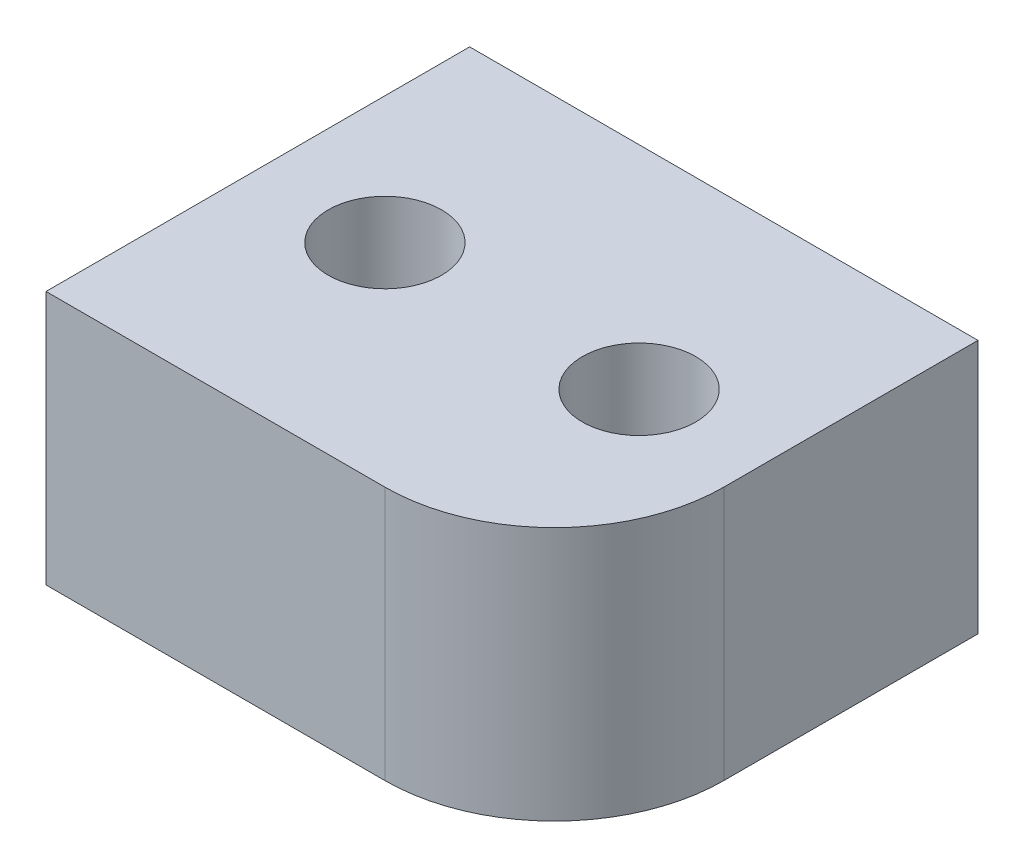
ISO-10303-21;
HEADER;
FILE_DESCRIPTION(('STEP AP214'),'2;1');
FILE_NAME('part.step','',(''),(''),'','','');
FILE_SCHEMA(('AUTOMOTIVE_DESIGN { 1 0 10303 214 1 1 1 1 }'));
ENDSEC;
DATA;
#1=APPLICATION_CONTEXT('core data for automotive mechanical design processes');
#2=APPLICATION_PROTOCOL_DEFINITION('international standard','automotive_design',2000,#1);
#3=PRODUCT_CONTEXT('',#1,'mechanical');
#4=PRODUCT('Part','Part','',(#3));
#5=PRODUCT_RELATED_PRODUCT_CATEGORY('part','',(#4));
#6=PRODUCT_DEFINITION_FORMATION('','',#4);
#7=PRODUCT_DEFINITION_CONTEXT('part definition',#1,'design');
#8=PRODUCT_DEFINITION('design','',#6,#7);
#9=PRODUCT_DEFINITION_SHAPE('','',#8);
#10=(LENGTH_UNIT() NAMED_UNIT(*) SI_UNIT(.MILLI.,.METRE.));
#11=(NAMED_UNIT(*) PLANE_ANGLE_UNIT() SI_UNIT($,.RADIAN.));
#12=(NAMED_UNIT(*) SI_UNIT($,.STERADIAN.) SOLID_ANGLE_UNIT());
#13=UNCERTAINTY_MEASURE_WITH_UNIT(LENGTH_MEASURE(1.E-05),#10,'distance_accuracy_value','');
#14=(GEOMETRIC_REPRESENTATION_CONTEXT(3) GLOBAL_UNCERTAINTY_ASSIGNED_CONTEXT((#13)) GLOBAL_UNIT_ASSIGNED_CONTEXT((#10,
#11,#12)) REPRESENTATION_CONTEXT('',''));
#15=CARTESIAN_POINT('',(0.,0.,0.));
#16=DIRECTION('',(0.,0.,1.));
#17=DIRECTION('',(1.,0.,0.));
#18=AXIS2_PLACEMENT_3D('',#15,#16,#17);
#19=CARTESIAN_POINT('',(0.,7.62,0.));
#20=DIRECTION('',(0.,-1.,0.));
#21=DIRECTION('',(0.,0.,-1.));
#22=AXIS2_PLACEMENT_3D('',#19,#20,#21);
#23=PLANE('',#22);
#24=DIRECTION('',(1.,0.,0.));
#25=VECTOR('',#24,1.);
#26=CARTESIAN_POINT('',(0.,7.62,0.));
#27=LINE('',#26,#25);
#28=CARTESIAN_POINT('',(0.,7.62,0.));
#29=VERTEX_POINT('',#28);
#30=CARTESIAN_POINT('',(10.16,7.62,0.));
#31=VERTEX_POINT('',#30);
#32=EDGE_CURVE('E88',#29,#31,#27,.T.);
#33=ORIENTED_EDGE('',*,*,#32,.T.);
#34=CARTESIAN_POINT('',(10.16,7.62,-5.08));
#35=DIRECTION('',(0.,-1.,0.));
#36=DIRECTION('',(0.,0.,-1.));
#37=AXIS2_PLACEMENT_3D('',#34,#35,#36);
#38=CIRCLE('',#37,5.08);
#39=CARTESIAN_POINT('',(15.24,7.62,-5.08));
#40=VERTEX_POINT('',#39);
#41=EDGE_CURVE('E11',#31,#40,#38,.F.);
#42=ORIENTED_EDGE('',*,*,#41,.T.);
#43=DIRECTION('',(0.,0.,-1.));
#44=VECTOR('',#43,1.);
#45=CARTESIAN_POINT('',(15.24,7.62,0.));
#46=LINE('',#45,#44);
#47=CARTESIAN_POINT('',(15.24,7.62,-12.7));
#48=VERTEX_POINT('',#47);
#49=EDGE_CURVE('E97',#40,#48,#46,.T.);
#50=ORIENTED_EDGE('',*,*,#49,.T.);
#51=DIRECTION('',(-1.,0.,0.));
#52=VECTOR('',#51,1.);
#53=CARTESIAN_POINT('',(0.,7.62,-12.7));
#54=LINE('',#53,#52);
#55=CARTESIAN_POINT('',(0.,7.62,-12.7));
#56=VERTEX_POINT('',#55);
#57=EDGE_CURVE('E103',#48,#56,#54,.T.);
#58=ORIENTED_EDGE('',*,*,#57,.T.);
#59=DIRECTION('',(0.,0.,1.));
#60=VECTOR('',#59,1.);
#61=CARTESIAN_POINT('',(0.,7.62,0.));
#62=LINE('',#61,#60);
#63=EDGE_CURVE('E98',#56,#29,#62,.T.);
#64=ORIENTED_EDGE('',*,*,#63,.T.);
#65=EDGE_LOOP('',(#33,#42,#50,#58,#64));
#66=FACE_BOUND('',#65,.T.);
#67=CARTESIAN_POINT('',(11.43,7.62,-6.35));
#68=DIRECTION('',(0.,1.,0.));
#69=DIRECTION('',(0.,0.,1.));
#70=AXIS2_PLACEMENT_3D('',#67,#68,#69);
#71=CIRCLE('',#70,1.7);
#72=CARTESIAN_POINT('',(11.43,7.62,-8.05));
#73=VERTEX_POINT('',#72);
#74=EDGE_CURVE('E140',#73,#73,#71,.T.);
#75=ORIENTED_EDGE('',*,*,#74,.F.);
#76=EDGE_LOOP('',(#75));
#77=FACE_BOUND('',#76,.T.);
#78=CARTESIAN_POINT('',(3.81,7.62,-6.35));
#79=DIRECTION('',(0.,1.,0.));
#80=DIRECTION('',(0.,0.,1.));
#81=AXIS2_PLACEMENT_3D('',#78,#79,#80);
#82=CIRCLE('',#81,1.7);
#83=CARTESIAN_POINT('',(3.81,7.62,-8.05));
#84=VERTEX_POINT('',#83);
#85=EDGE_CURVE('E149',#84,#84,#82,.T.);
#86=ORIENTED_EDGE('',*,*,#85,.F.);
#87=EDGE_LOOP('',(#86));
#88=FACE_BOUND('',#87,.T.);
#89=ADVANCED_FACE('F44',(#66,#77,#88),#23,.F.);
#90=CARTESIAN_POINT('',(0.,0.,0.));
#91=DIRECTION('',(0.,-1.,0.));
#92=DIRECTION('',(0.,0.,-1.));
#93=AXIS2_PLACEMENT_3D('',#90,#91,#92);
#94=PLANE('',#93);
#95=CARTESIAN_POINT('',(11.43,0.,-6.35));
#96=DIRECTION('',(0.,1.,0.));
#97=DIRECTION('',(0.,0.,1.));
#98=AXIS2_PLACEMENT_3D('',#95,#96,#97);
#99=CIRCLE('',#98,1.7);
#100=CARTESIAN_POINT('',(11.43,0.,-8.05));
#101=VERTEX_POINT('',#100);
#102=EDGE_CURVE('E145',#101,#101,#99,.T.);
#103=ORIENTED_EDGE('',*,*,#102,.T.);
#104=EDGE_LOOP('',(#103));
#105=FACE_BOUND('',#104,.T.);
#106=DIRECTION('',(0.,0.,-1.));
#107=VECTOR('',#106,1.);
#108=CARTESIAN_POINT('',(15.24,0.,0.));
#109=LINE('',#108,#107);
#110=CARTESIAN_POINT('',(15.24,0.,-5.08));
#111=VERTEX_POINT('',#110);
#112=CARTESIAN_POINT('',(15.24,0.,-12.7));
#113=VERTEX_POINT('',#112);
#114=EDGE_CURVE('E132',#111,#113,#109,.T.);
#115=ORIENTED_EDGE('',*,*,#114,.F.);
#116=CARTESIAN_POINT('',(10.16,0.,-5.08));
#117=DIRECTION('',(0.,-1.,0.));
#118=DIRECTION('',(0.,0.,-1.));
#119=AXIS2_PLACEMENT_3D('',#116,#117,#118);
#120=CIRCLE('',#119,5.08);
#121=CARTESIAN_POINT('',(10.16,0.,0.));
#122=VERTEX_POINT('',#121);
#123=EDGE_CURVE('E67',#111,#122,#120,.T.);
#124=ORIENTED_EDGE('',*,*,#123,.T.);
#125=DIRECTION('',(1.,0.,0.));
#126=VECTOR('',#125,1.);
#127=CARTESIAN_POINT('',(0.,0.,0.));
#128=LINE('',#127,#126);
#129=CARTESIAN_POINT('',(0.,0.,0.));
#130=VERTEX_POINT('',#129);
#131=EDGE_CURVE('E135',#130,#122,#128,.T.);
#132=ORIENTED_EDGE('',*,*,#131,.F.);
#133=DIRECTION('',(0.,0.,1.));
#134=VECTOR('',#133,1.);
#135=CARTESIAN_POINT('',(0.,0.,0.));
#136=LINE('',#135,#134);
#137=CARTESIAN_POINT('',(0.,0.,-12.7));
#138=VERTEX_POINT('',#137);
#139=EDGE_CURVE('E112',#138,#130,#136,.T.);
#140=ORIENTED_EDGE('',*,*,#139,.F.);
#141=DIRECTION('',(-1.,0.,0.));
#142=VECTOR('',#141,1.);
#143=CARTESIAN_POINT('',(0.,0.,-12.7));
#144=LINE('',#143,#142);
#145=EDGE_CURVE('E108',#113,#138,#144,.T.);
#146=ORIENTED_EDGE('',*,*,#145,.F.);
#147=EDGE_LOOP('',(#115,#124,#132,#140,#146));
#148=FACE_BOUND('',#147,.T.);
#149=CARTESIAN_POINT('',(3.81,0.,-6.35));
#150=DIRECTION('',(0.,1.,0.));
#151=DIRECTION('',(0.,0.,1.));
#152=AXIS2_PLACEMENT_3D('',#149,#150,#151);
#153=CIRCLE('',#152,1.7);
#154=CARTESIAN_POINT('',(3.81,0.,-8.05));
#155=VERTEX_POINT('',#154);
#156=EDGE_CURVE('E153',#155,#155,#153,.T.);
#157=ORIENTED_EDGE('',*,*,#156,.T.);
#158=EDGE_LOOP('',(#157));
#159=FACE_BOUND('',#158,.T.);
#160=ADVANCED_FACE('F165',(#105,#148,#159),#94,.T.);
#161=CARTESIAN_POINT('',(0.,7.62,0.));
#162=DIRECTION('',(1.,0.,0.));
#163=DIRECTION('',(0.,0.,-1.));
#164=AXIS2_PLACEMENT_3D('',#161,#162,#163);
#165=PLANE('',#164);
#166=ORIENTED_EDGE('',*,*,#139,.T.);
#167=DIRECTION('',(0.,-1.,0.));
#168=VECTOR('',#167,1.);
#169=CARTESIAN_POINT('',(0.,7.62,0.));
#170=LINE('',#169,#168);
#171=EDGE_CURVE('E92',#29,#130,#170,.T.);
#172=ORIENTED_EDGE('',*,*,#171,.F.);
#173=ORIENTED_EDGE('',*,*,#63,.F.);
#174=DIRECTION('',(0.,-1.,0.));
#175=VECTOR('',#174,1.);
#176=CARTESIAN_POINT('',(0.,7.62,-12.7));
#177=LINE('',#176,#175);
#178=EDGE_CURVE('E122',#56,#138,#177,.T.);
#179=ORIENTED_EDGE('',*,*,#178,.T.);
#180=EDGE_LOOP('',(#166,#172,#173,#179));
#181=FACE_BOUND('',#180,.T.);
#182=ADVANCED_FACE('F110',(#181),#165,.F.);
#183=CARTESIAN_POINT('',(0.,7.62,0.));
#184=DIRECTION('',(0.,0.,-1.));
#185=DIRECTION('',(-1.,0.,0.));
#186=AXIS2_PLACEMENT_3D('',#183,#184,#185);
#187=PLANE('',#186);
#188=ORIENTED_EDGE('',*,*,#131,.T.);
#189=DIRECTION('',(0.,-1.,0.));
#190=VECTOR('',#189,1.);
#191=CARTESIAN_POINT('',(10.16,7.62,0.));
#192=LINE('',#191,#190);
#193=EDGE_CURVE('E53',#122,#31,#192,.F.);
#194=ORIENTED_EDGE('',*,*,#193,.T.);
#195=ORIENTED_EDGE('',*,*,#32,.F.);
#196=ORIENTED_EDGE('',*,*,#171,.T.);
#197=EDGE_LOOP('',(#188,#194,#195,#196));
#198=FACE_BOUND('',#197,.T.);
#199=ADVANCED_FACE('F90',(#198),#187,.F.);
#200=CARTESIAN_POINT('',(15.24,7.62,0.));
#201=DIRECTION('',(-1.,0.,0.));
#202=DIRECTION('',(0.,0.,1.));
#203=AXIS2_PLACEMENT_3D('',#200,#201,#202);
#204=PLANE('',#203);
#205=ORIENTED_EDGE('',*,*,#49,.F.);
#206=DIRECTION('',(0.,-1.,0.));
#207=VECTOR('',#206,1.);
#208=CARTESIAN_POINT('',(15.24,7.62,-5.08));
#209=LINE('',#208,#207);
#210=EDGE_CURVE('E114',#40,#111,#209,.T.);
#211=ORIENTED_EDGE('',*,*,#210,.T.);
#212=ORIENTED_EDGE('',*,*,#114,.T.);
#213=DIRECTION('',(0.,-1.,0.));
#214=VECTOR('',#213,1.);
#215=CARTESIAN_POINT('',(15.24,7.62,-12.7));
#216=LINE('',#215,#214);
#217=EDGE_CURVE('E115',#48,#113,#216,.T.);
#218=ORIENTED_EDGE('',*,*,#217,.F.);
#219=EDGE_LOOP('',(#205,#211,#212,#218));
#220=FACE_BOUND('',#219,.T.);
#221=ADVANCED_FACE('F180',(#220),#204,.F.);
#222=CARTESIAN_POINT('',(0.,7.62,-12.7));
#223=DIRECTION('',(0.,0.,1.));
#224=DIRECTION('',(1.,0.,0.));
#225=AXIS2_PLACEMENT_3D('',#222,#223,#224);
#226=PLANE('',#225);
#227=ORIENTED_EDGE('',*,*,#145,.T.);
#228=ORIENTED_EDGE('',*,*,#178,.F.);
#229=ORIENTED_EDGE('',*,*,#57,.F.);
#230=ORIENTED_EDGE('',*,*,#217,.T.);
#231=EDGE_LOOP('',(#227,#228,#229,#230));
#232=FACE_BOUND('',#231,.T.);
#233=ADVANCED_FACE('F177',(#232),#226,.F.);
#234=CARTESIAN_POINT('',(11.43,7.62,-6.35));
#235=DIRECTION('',(0.,-1.,0.));
#236=DIRECTION('',(0.,0.,-1.));
#237=AXIS2_PLACEMENT_3D('',#234,#235,#236);
#238=CYLINDRICAL_SURFACE('',#237,1.7);
#239=CARTESIAN_POINT('',(11.43,7.62,-8.05));
#240=CARTESIAN_POINT('',(11.43,7.540625,-8.05));
#241=CARTESIAN_POINT('',(11.43,7.46125,-8.05));
#242=CARTESIAN_POINT('',(11.43,7.3025,-8.05));
#243=CARTESIAN_POINT('',(11.43,7.223125,-8.05));
#244=CARTESIAN_POINT('',(11.43,7.064375,-8.05));
#245=CARTESIAN_POINT('',(11.43,6.985,-8.05));
#246=CARTESIAN_POINT('',(11.43,6.82625,-8.05));
#247=CARTESIAN_POINT('',(11.43,6.746875,-8.05));
#248=CARTESIAN_POINT('',(11.43,6.588125,-8.05));
#249=CARTESIAN_POINT('',(11.43,6.50875,-8.05));
#250=CARTESIAN_POINT('',(11.43,6.35,-8.05));
#251=CARTESIAN_POINT('',(11.43,6.270625,-8.05));
#252=CARTESIAN_POINT('',(11.43,6.111875,-8.05));
#253=CARTESIAN_POINT('',(11.43,6.0325,-8.05));
#254=CARTESIAN_POINT('',(11.43,5.87375,-8.05));
#255=CARTESIAN_POINT('',(11.43,5.794375,-8.05));
#256=CARTESIAN_POINT('',(11.43,5.635625,-8.05));
#257=CARTESIAN_POINT('',(11.43,5.55625,-8.05));
#258=CARTESIAN_POINT('',(11.43,5.3975,-8.05));
#259=CARTESIAN_POINT('',(11.43,5.318125,-8.05));
#260=CARTESIAN_POINT('',(11.43,5.159375,-8.05));
#261=CARTESIAN_POINT('',(11.43,5.08,-8.05));
#262=CARTESIAN_POINT('',(11.43,4.92125,-8.05));
#263=CARTESIAN_POINT('',(11.43,4.841875,-8.05));
#264=CARTESIAN_POINT('',(11.43,4.683125,-8.05));
#265=CARTESIAN_POINT('',(11.43,4.60375,-8.05));
#266=CARTESIAN_POINT('',(11.43,4.445,-8.05));
#267=CARTESIAN_POINT('',(11.43,4.365625,-8.05));
#268=CARTESIAN_POINT('',(11.43,4.206875,-8.05));
#269=CARTESIAN_POINT('',(11.43,4.1275,-8.05));
#270=CARTESIAN_POINT('',(11.43,3.96875,-8.05));
#271=CARTESIAN_POINT('',(11.43,3.889375,-8.05));
#272=CARTESIAN_POINT('',(11.43,3.730625,-8.05));
#273=CARTESIAN_POINT('',(11.43,3.65125,-8.05));
#274=CARTESIAN_POINT('',(11.43,3.4925,-8.05));
#275=CARTESIAN_POINT('',(11.43,3.413125,-8.05));
#276=CARTESIAN_POINT('',(11.43,3.254375,-8.05));
#277=CARTESIAN_POINT('',(11.43,3.175,-8.05));
#278=CARTESIAN_POINT('',(11.43,3.01625,-8.05));
#279=CARTESIAN_POINT('',(11.43,2.936875,-8.05));
#280=CARTESIAN_POINT('',(11.43,2.778125,-8.05));
#281=CARTESIAN_POINT('',(11.43,2.69875,-8.05));
#282=CARTESIAN_POINT('',(11.43,2.54,-8.05));
#283=CARTESIAN_POINT('',(11.43,2.460625,-8.05));
#284=CARTESIAN_POINT('',(11.43,2.301875,-8.05));
#285=CARTESIAN_POINT('',(11.43,2.2225,-8.05));
#286=CARTESIAN_POINT('',(11.43,2.06375,-8.05));
#287=CARTESIAN_POINT('',(11.43,1.984375,-8.05));
#288=CARTESIAN_POINT('',(11.43,1.825625,-8.05));
#289=CARTESIAN_POINT('',(11.43,1.74625,-8.05));
#290=CARTESIAN_POINT('',(11.43,1.5875,-8.05));
#291=CARTESIAN_POINT('',(11.43,1.508125,-8.05));
#292=CARTESIAN_POINT('',(11.43,1.349375,-8.05));
#293=CARTESIAN_POINT('',(11.43,1.27,-8.05));
#294=CARTESIAN_POINT('',(11.43,1.11125,-8.05));
#295=CARTESIAN_POINT('',(11.43,1.031875,-8.05));
#296=CARTESIAN_POINT('',(11.43,0.873125,-8.05));
#297=CARTESIAN_POINT('',(11.43,0.79375,-8.05));
#298=CARTESIAN_POINT('',(11.43,0.635,-8.05));
#299=CARTESIAN_POINT('',(11.43,0.555625,-8.05));
#300=CARTESIAN_POINT('',(11.43,0.396875,-8.05));
#301=CARTESIAN_POINT('',(11.43,0.3175,-8.05));
#302=CARTESIAN_POINT('',(11.43,0.15875,-8.05));
#303=CARTESIAN_POINT('',(11.43,0.0793749999999999,-8.05));
#304=CARTESIAN_POINT('',(11.43,0.,-8.05));
#305=B_SPLINE_CURVE_WITH_KNOTS('',3,(#239,#240,#241,#242,#243,#244,#245,#246,#247,#248,#249,
#250,#251,#252,#253,#254,#255,#256,#257,#258,#259,#260,#261,#262,#263,#264,#265,#266,#267,#268,
#269,#270,#271,#272,#273,#274,#275,#276,#277,#278,#279,#280,#281,#282,#283,#284,#285,#286,#287,
#288,#289,#290,#291,#292,#293,#294,#295,#296,#297,#298,#299,#300,#301,#302,#303,#304),
.UNSPECIFIED.,.F.,.F.,(4,2,2,2,2,2,2,2,2,2,2,2,2,2,2,2,2,2,2,2,2,2,2,2,2,2,2,2,2,2,2,2,4),(0.,
0.238125,0.47625,0.714375000000001,0.9525,1.190625,1.42875,1.666875,1.905,2.143125,2.38125,
2.619375,2.8575,3.095625,3.33375,3.571875,3.81,4.048125,4.28625,4.524375,4.7625,5.000625,
5.23875,5.476875,5.715,5.953125,6.19125,6.429375,6.6675,6.905625,7.14375,7.381875,7.62),.UNSPECIFIED.);
#306=EDGE_CURVE('BSEAM174',#73,#101,#305,.T.);
#307=ORIENTED_EDGE('',*,*,#74,.T.);
#308=ORIENTED_EDGE('',*,*,#102,.F.);
#309=ORIENTED_EDGE('',*,*,#306,.T.);
#310=ORIENTED_EDGE('',*,*,#306,.F.);
#311=EDGE_LOOP('',(#307,#309,#308,#310));
#312=FACE_BOUND('',#311,.T.);
#313=ADVANCED_FACE('F174',(#312),#238,.F.);
#314=CARTESIAN_POINT('',(3.81,7.62,-6.35));
#315=DIRECTION('',(0.,-1.,0.));
#316=DIRECTION('',(0.,0.,-1.));
#317=AXIS2_PLACEMENT_3D('',#314,#315,#316);
#318=CYLINDRICAL_SURFACE('',#317,1.7);
#319=CARTESIAN_POINT('',(3.81,7.62,-8.05));
#320=CARTESIAN_POINT('',(3.81,7.540625,-8.05));
#321=CARTESIAN_POINT('',(3.81,7.46125,-8.05));
#322=CARTESIAN_POINT('',(3.81,7.3025,-8.05));
#323=CARTESIAN_POINT('',(3.81,7.223125,-8.05));
#324=CARTESIAN_POINT('',(3.81,7.064375,-8.05));
#325=CARTESIAN_POINT('',(3.81,6.985,-8.05));
#326=CARTESIAN_POINT('',(3.81,6.82625,-8.05));
#327=CARTESIAN_POINT('',(3.81,6.746875,-8.05));
#328=CARTESIAN_POINT('',(3.81,6.588125,-8.05));
#329=CARTESIAN_POINT('',(3.81,6.50875,-8.05));
#330=CARTESIAN_POINT('',(3.81,6.35,-8.05));
#331=CARTESIAN_POINT('',(3.81,6.270625,-8.05));
#332=CARTESIAN_POINT('',(3.81,6.111875,-8.05));
#333=CARTESIAN_POINT('',(3.81,6.0325,-8.05));
#334=CARTESIAN_POINT('',(3.81,5.87375,-8.05));
#335=CARTESIAN_POINT('',(3.81,5.794375,-8.05));
#336=CARTESIAN_POINT('',(3.81,5.635625,-8.05));
#337=CARTESIAN_POINT('',(3.81,5.55625,-8.05));
#338=CARTESIAN_POINT('',(3.81,5.3975,-8.05));
#339=CARTESIAN_POINT('',(3.81,5.318125,-8.05));
#340=CARTESIAN_POINT('',(3.81,5.159375,-8.05));
#341=CARTESIAN_POINT('',(3.81,5.08,-8.05));
#342=CARTESIAN_POINT('',(3.81,4.92125,-8.05));
#343=CARTESIAN_POINT('',(3.81,4.841875,-8.05));
#344=CARTESIAN_POINT('',(3.81,4.683125,-8.05));
#345=CARTESIAN_POINT('',(3.81,4.60375,-8.05));
#346=CARTESIAN_POINT('',(3.81,4.445,-8.05));
#347=CARTESIAN_POINT('',(3.81,4.365625,-8.05));
#348=CARTESIAN_POINT('',(3.81,4.206875,-8.05));
#349=CARTESIAN_POINT('',(3.81,4.1275,-8.05));
#350=CARTESIAN_POINT('',(3.81,3.96875,-8.05));
#351=CARTESIAN_POINT('',(3.81,3.889375,-8.05));
#352=CARTESIAN_POINT('',(3.81,3.730625,-8.05));
#353=CARTESIAN_POINT('',(3.81,3.65125,-8.05));
#354=CARTESIAN_POINT('',(3.81,3.4925,-8.05));
#355=CARTESIAN_POINT('',(3.81,3.413125,-8.05));
#356=CARTESIAN_POINT('',(3.81,3.254375,-8.05));
#357=CARTESIAN_POINT('',(3.81,3.175,-8.05));
#358=CARTESIAN_POINT('',(3.81,3.01625,-8.05));
#359=CARTESIAN_POINT('',(3.81,2.936875,-8.05));
#360=CARTESIAN_POINT('',(3.81,2.778125,-8.05));
#361=CARTESIAN_POINT('',(3.81,2.69875,-8.05));
#362=CARTESIAN_POINT('',(3.81,2.54,-8.05));
#363=CARTESIAN_POINT('',(3.81,2.460625,-8.05));
#364=CARTESIAN_POINT('',(3.81,2.301875,-8.05));
#365=CARTESIAN_POINT('',(3.81,2.2225,-8.05));
#366=CARTESIAN_POINT('',(3.81,2.06375,-8.05));
#367=CARTESIAN_POINT('',(3.81,1.984375,-8.05));
#368=CARTESIAN_POINT('',(3.81,1.825625,-8.05));
#369=CARTESIAN_POINT('',(3.81,1.74625,-8.05));
#370=CARTESIAN_POINT('',(3.81,1.5875,-8.05));
#371=CARTESIAN_POINT('',(3.81,1.508125,-8.05));
#372=CARTESIAN_POINT('',(3.81,1.349375,-8.05));
#373=CARTESIAN_POINT('',(3.81,1.27,-8.05));
#374=CARTESIAN_POINT('',(3.81,1.11125,-8.05));
#375=CARTESIAN_POINT('',(3.81,1.031875,-8.05));
#376=CARTESIAN_POINT('',(3.81,0.873125,-8.05));
#377=CARTESIAN_POINT('',(3.81,0.79375,-8.05));
#378=CARTESIAN_POINT('',(3.81,0.635,-8.05));
#379=CARTESIAN_POINT('',(3.81,0.555625,-8.05));
#380=CARTESIAN_POINT('',(3.81,0.396875,-8.05));
#381=CARTESIAN_POINT('',(3.81,0.3175,-8.05));
#382=CARTESIAN_POINT('',(3.81,0.15875,-8.05));
#383=CARTESIAN_POINT('',(3.81,0.0793749999999999,-8.05));
#384=CARTESIAN_POINT('',(3.81,0.,-8.05));
#385=B_SPLINE_CURVE_WITH_KNOTS('',3,(#319,#320,#321,#322,#323,#324,#325,#326,#327,#328,#329,
#330,#331,#332,#333,#334,#335,#336,#337,#338,#339,#340,#341,#342,#343,#344,#345,#346,#347,#348,
#349,#350,#351,#352,#353,#354,#355,#356,#357,#358,#359,#360,#361,#362,#363,#364,#365,#366,#367,
#368,#369,#370,#371,#372,#373,#374,#375,#376,#377,#378,#379,#380,#381,#382,#383,#384),
.UNSPECIFIED.,.F.,.F.,(4,2,2,2,2,2,2,2,2,2,2,2,2,2,2,2,2,2,2,2,2,2,2,2,2,2,2,2,2,2,2,2,4),(0.,
0.238125,0.47625,0.714375000000001,0.9525,1.190625,1.42875,1.666875,1.905,2.143125,2.38125,
2.619375,2.8575,3.095625,3.33375,3.571875,3.81,4.048125,4.28625,4.524375,4.7625,5.000625,
5.23875,5.476875,5.715,5.953125,6.19125,6.429375,6.6675,6.905625,7.14375,7.381875,7.62),.UNSPECIFIED.);
#386=EDGE_CURVE('BSEAM161',#84,#155,#385,.T.);
#387=ORIENTED_EDGE('',*,*,#85,.T.);
#388=ORIENTED_EDGE('',*,*,#156,.F.);
#389=ORIENTED_EDGE('',*,*,#386,.T.);
#390=ORIENTED_EDGE('',*,*,#386,.F.);
#391=EDGE_LOOP('',(#387,#389,#388,#390));
#392=FACE_BOUND('',#391,.T.);
#393=ADVANCED_FACE('F161',(#392),#318,.F.);
#394=CARTESIAN_POINT('',(10.16,7.62,-5.08));
#395=DIRECTION('',(0.,-1.,0.));
#396=DIRECTION('',(0.,0.,-1.));
#397=AXIS2_PLACEMENT_3D('',#394,#395,#396);
#398=CYLINDRICAL_SURFACE('',#397,5.08);
#399=ORIENTED_EDGE('',*,*,#41,.F.);
#400=ORIENTED_EDGE('',*,*,#193,.F.);
#401=ORIENTED_EDGE('',*,*,#123,.F.);
#402=ORIENTED_EDGE('',*,*,#210,.F.);
#403=EDGE_LOOP('',(#399,#400,#401,#402));
#404=FACE_BOUND('',#403,.T.);
#405=ADVANCED_FACE('F46',(#404),#398,.T.);
#406=CLOSED_SHELL('',(#89,#160,#182,#199,#221,#233,#313,#393,#405));
#407=MANIFOLD_SOLID_BREP('B2',#406);
#408=ADVANCED_BREP_SHAPE_REPRESENTATION('',(#18,#407),#14);
#409=SHAPE_DEFINITION_REPRESENTATION(#9,#408);
ENDSEC;
END-ISO-10303-21;
